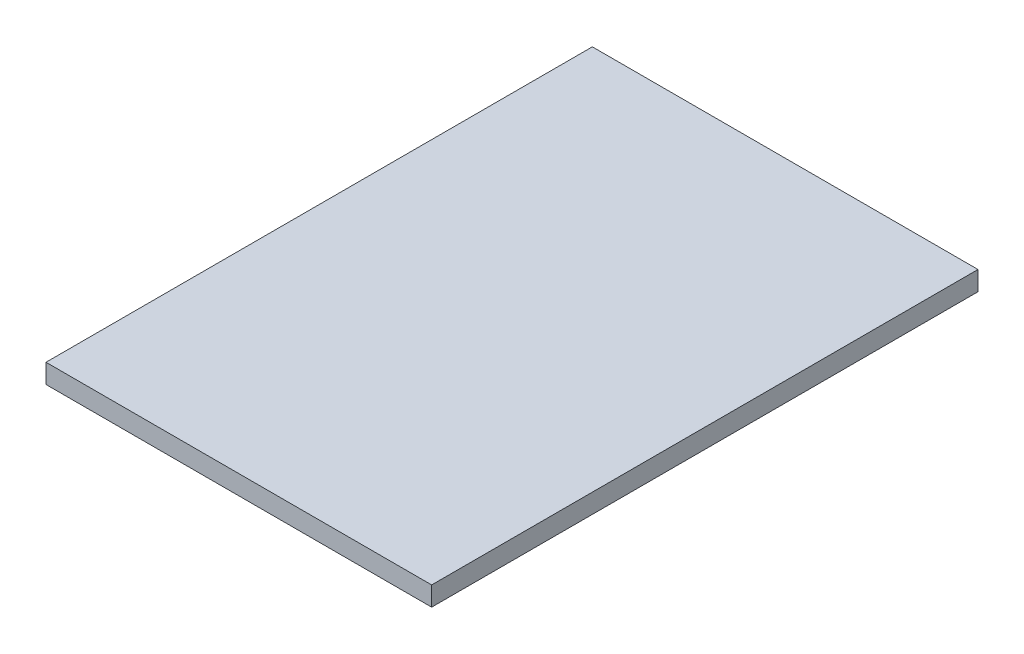
ISO-10303-21;
HEADER;
FILE_DESCRIPTION(('STEP AP214'),'2;1');
FILE_NAME('part.step','',(''),(''),'','','');
FILE_SCHEMA(('AUTOMOTIVE_DESIGN { 1 0 10303 214 1 1 1 1 }'));
ENDSEC;
DATA;
#1=APPLICATION_CONTEXT('core data for automotive mechanical design processes');
#2=APPLICATION_PROTOCOL_DEFINITION('international standard','automotive_design',2000,#1);
#3=PRODUCT_CONTEXT('',#1,'mechanical');
#4=PRODUCT('Part','Part','',(#3));
#5=PRODUCT_RELATED_PRODUCT_CATEGORY('part','',(#4));
#6=PRODUCT_DEFINITION_FORMATION('','',#4);
#7=PRODUCT_DEFINITION_CONTEXT('part definition',#1,'design');
#8=PRODUCT_DEFINITION('design','',#6,#7);
#9=PRODUCT_DEFINITION_SHAPE('','',#8);
#10=(LENGTH_UNIT() NAMED_UNIT(*) SI_UNIT(.MILLI.,.METRE.));
#11=(NAMED_UNIT(*) PLANE_ANGLE_UNIT() SI_UNIT($,.RADIAN.));
#12=(NAMED_UNIT(*) SI_UNIT($,.STERADIAN.) SOLID_ANGLE_UNIT());
#13=UNCERTAINTY_MEASURE_WITH_UNIT(LENGTH_MEASURE(1.E-05),#10,'distance_accuracy_value','');
#14=(GEOMETRIC_REPRESENTATION_CONTEXT(3) GLOBAL_UNCERTAINTY_ASSIGNED_CONTEXT((#13)) GLOBAL_UNIT_ASSIGNED_CONTEXT((#10,
#11,#12)) REPRESENTATION_CONTEXT('',''));
#15=CARTESIAN_POINT('',(0.,0.,0.));
#16=DIRECTION('',(0.,0.,1.));
#17=DIRECTION('',(1.,0.,0.));
#18=AXIS2_PLACEMENT_3D('',#15,#16,#17);
#19=CARTESIAN_POINT('',(64.,3.,0.));
#20=DIRECTION('',(-1.,0.,0.));
#21=DIRECTION('',(0.,0.,1.));
#22=AXIS2_PLACEMENT_3D('',#19,#20,#21);
#23=PLANE('',#22);
#24=DIRECTION('',(0.,0.,-1.));
#25=VECTOR('',#24,1.);
#26=CARTESIAN_POINT('',(64.,0.,0.));
#27=LINE('',#26,#25);
#28=CARTESIAN_POINT('',(64.,0.,85.));
#29=VERTEX_POINT('',#28);
#30=CARTESIAN_POINT('',(64.,0.,0.));
#31=VERTEX_POINT('',#30);
#32=EDGE_CURVE('E98',#29,#31,#27,.T.);
#33=ORIENTED_EDGE('',*,*,#32,.T.);
#34=DIRECTION('',(0.,-1.,0.));
#35=VECTOR('',#34,1.);
#36=CARTESIAN_POINT('',(64.,3.,0.));
#37=LINE('',#36,#35);
#38=CARTESIAN_POINT('',(64.,3.,0.));
#39=VERTEX_POINT('',#38);
#40=EDGE_CURVE('E11',#39,#31,#37,.T.);
#41=ORIENTED_EDGE('',*,*,#40,.F.);
#42=DIRECTION('',(0.,0.,-1.));
#43=VECTOR('',#42,1.);
#44=CARTESIAN_POINT('',(64.,3.,0.));
#45=LINE('',#44,#43);
#46=CARTESIAN_POINT('',(64.,3.,85.));
#47=VERTEX_POINT('',#46);
#48=EDGE_CURVE('E86',#47,#39,#45,.T.);
#49=ORIENTED_EDGE('',*,*,#48,.F.);
#50=DIRECTION('',(0.,-1.,0.));
#51=VECTOR('',#50,1.);
#52=CARTESIAN_POINT('',(64.,3.,85.));
#53=LINE('',#52,#51);
#54=EDGE_CURVE('E94',#47,#29,#53,.T.);
#55=ORIENTED_EDGE('',*,*,#54,.T.);
#56=EDGE_LOOP('',(#33,#41,#49,#55));
#57=FACE_BOUND('',#56,.T.);
#58=ADVANCED_FACE('F35',(#57),#23,.F.);
#59=CARTESIAN_POINT('',(64.,3.,0.));
#60=DIRECTION('',(0.,0.,1.));
#61=DIRECTION('',(1.,0.,0.));
#62=AXIS2_PLACEMENT_3D('',#59,#60,#61);
#63=PLANE('',#62);
#64=DIRECTION('',(-1.,0.,0.));
#65=VECTOR('',#64,1.);
#66=CARTESIAN_POINT('',(64.,0.,0.));
#67=LINE('',#66,#65);
#68=CARTESIAN_POINT('',(4.,0.,0.));
#69=VERTEX_POINT('',#68);
#70=EDGE_CURVE('E90',#31,#69,#67,.T.);
#71=ORIENTED_EDGE('',*,*,#70,.T.);
#72=DIRECTION('',(0.,-1.,0.));
#73=VECTOR('',#72,1.);
#74=CARTESIAN_POINT('',(4.,3.,0.));
#75=LINE('',#74,#73);
#76=CARTESIAN_POINT('',(4.,3.,0.));
#77=VERTEX_POINT('',#76);
#78=EDGE_CURVE('E43',#77,#69,#75,.T.);
#79=ORIENTED_EDGE('',*,*,#78,.F.);
#80=DIRECTION('',(-1.,0.,0.));
#81=VECTOR('',#80,1.);
#82=CARTESIAN_POINT('',(64.,3.,0.));
#83=LINE('',#82,#81);
#84=EDGE_CURVE('E81',#39,#77,#83,.T.);
#85=ORIENTED_EDGE('',*,*,#84,.F.);
#86=ORIENTED_EDGE('',*,*,#40,.T.);
#87=EDGE_LOOP('',(#71,#79,#85,#86));
#88=FACE_BOUND('',#87,.T.);
#89=ADVANCED_FACE('F89',(#88),#63,.F.);
#90=CARTESIAN_POINT('',(4.,3.,0.));
#91=DIRECTION('',(1.,0.,0.));
#92=DIRECTION('',(0.,0.,-1.));
#93=AXIS2_PLACEMENT_3D('',#90,#91,#92);
#94=PLANE('',#93);
#95=DIRECTION('',(0.,0.,1.));
#96=VECTOR('',#95,1.);
#97=CARTESIAN_POINT('',(4.,0.,0.));
#98=LINE('',#97,#96);
#99=CARTESIAN_POINT('',(4.,0.,85.));
#100=VERTEX_POINT('',#99);
#101=EDGE_CURVE('E68',#69,#100,#98,.T.);
#102=ORIENTED_EDGE('',*,*,#101,.T.);
#103=DIRECTION('',(0.,-1.,0.));
#104=VECTOR('',#103,1.);
#105=CARTESIAN_POINT('',(4.,3.,85.));
#106=LINE('',#105,#104);
#107=CARTESIAN_POINT('',(4.,3.,85.));
#108=VERTEX_POINT('',#107);
#109=EDGE_CURVE('E91',#108,#100,#106,.T.);
#110=ORIENTED_EDGE('',*,*,#109,.F.);
#111=DIRECTION('',(0.,0.,1.));
#112=VECTOR('',#111,1.);
#113=CARTESIAN_POINT('',(4.,3.,0.));
#114=LINE('',#113,#112);
#115=EDGE_CURVE('E84',#77,#108,#114,.T.);
#116=ORIENTED_EDGE('',*,*,#115,.F.);
#117=ORIENTED_EDGE('',*,*,#78,.T.);
#118=EDGE_LOOP('',(#102,#110,#116,#117));
#119=FACE_BOUND('',#118,.T.);
#120=ADVANCED_FACE('F92',(#119),#94,.F.);
#121=CARTESIAN_POINT('',(4.,3.,85.));
#122=DIRECTION('',(0.,0.,-1.));
#123=DIRECTION('',(-1.,0.,0.));
#124=AXIS2_PLACEMENT_3D('',#121,#122,#123);
#125=PLANE('',#124);
#126=DIRECTION('',(1.,0.,0.));
#127=VECTOR('',#126,1.);
#128=CARTESIAN_POINT('',(4.,0.,85.));
#129=LINE('',#128,#127);
#130=EDGE_CURVE('E74',#100,#29,#129,.T.);
#131=ORIENTED_EDGE('',*,*,#130,.T.);
#132=ORIENTED_EDGE('',*,*,#54,.F.);
#133=DIRECTION('',(1.,0.,0.));
#134=VECTOR('',#133,1.);
#135=CARTESIAN_POINT('',(4.,3.,85.));
#136=LINE('',#135,#134);
#137=EDGE_CURVE('E51',#108,#47,#136,.T.);
#138=ORIENTED_EDGE('',*,*,#137,.F.);
#139=ORIENTED_EDGE('',*,*,#109,.T.);
#140=EDGE_LOOP('',(#131,#132,#138,#139));
#141=FACE_BOUND('',#140,.T.);
#142=ADVANCED_FACE('F105',(#141),#125,.F.);
#143=CARTESIAN_POINT('',(0.,3.,0.));
#144=DIRECTION('',(0.,1.,0.));
#145=DIRECTION('',(0.,0.,1.));
#146=AXIS2_PLACEMENT_3D('',#143,#144,#145);
#147=PLANE('',#146);
#148=ORIENTED_EDGE('',*,*,#48,.T.);
#149=ORIENTED_EDGE('',*,*,#84,.T.);
#150=ORIENTED_EDGE('',*,*,#115,.T.);
#151=ORIENTED_EDGE('',*,*,#137,.T.);
#152=EDGE_LOOP('',(#148,#149,#150,#151));
#153=FACE_BOUND('',#152,.T.);
#154=ADVANCED_FACE('F82',(#153),#147,.T.);
#155=CARTESIAN_POINT('',(0.,0.,0.));
#156=DIRECTION('',(0.,1.,0.));
#157=DIRECTION('',(0.,0.,1.));
#158=AXIS2_PLACEMENT_3D('',#155,#156,#157);
#159=PLANE('',#158);
#160=ORIENTED_EDGE('',*,*,#32,.F.);
#161=ORIENTED_EDGE('',*,*,#130,.F.);
#162=ORIENTED_EDGE('',*,*,#101,.F.);
#163=ORIENTED_EDGE('',*,*,#70,.F.);
#164=EDGE_LOOP('',(#160,#161,#162,#163));
#165=FACE_BOUND('',#164,.T.);
#166=ADVANCED_FACE('F108',(#165),#159,.F.);
#167=CLOSED_SHELL('',(#58,#89,#120,#142,#154,#166));
#168=MANIFOLD_SOLID_BREP('B2',#167);
#169=ADVANCED_BREP_SHAPE_REPRESENTATION('',(#18,#168),#14);
#170=SHAPE_DEFINITION_REPRESENTATION(#9,#169);
ENDSEC;
END-ISO-10303-21;
